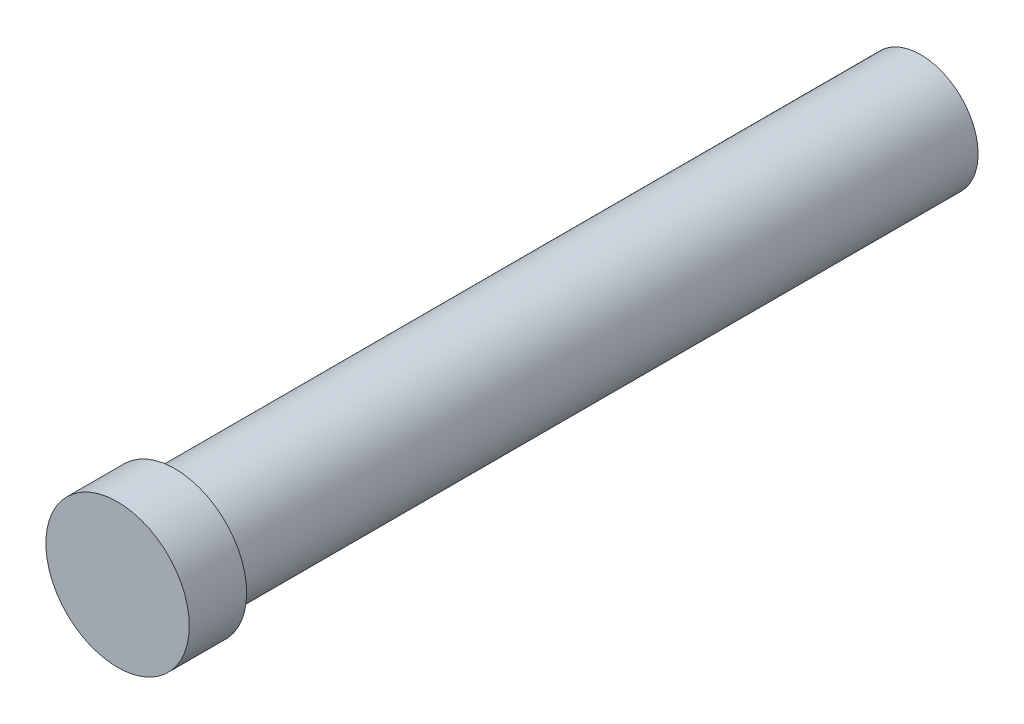
ISO-10303-21;
HEADER;
FILE_DESCRIPTION(('STEP AP214'),'2;1');
FILE_NAME('part.step','',(''),(''),'','','');
FILE_SCHEMA(('AUTOMOTIVE_DESIGN { 1 0 10303 214 1 1 1 1 }'));
ENDSEC;
DATA;
#1=APPLICATION_CONTEXT('core data for automotive mechanical design processes');
#2=APPLICATION_PROTOCOL_DEFINITION('international standard','automotive_design',2000,#1);
#3=PRODUCT_CONTEXT('',#1,'mechanical');
#4=PRODUCT('Part','Part','',(#3));
#5=PRODUCT_RELATED_PRODUCT_CATEGORY('part','',(#4));
#6=PRODUCT_DEFINITION_FORMATION('','',#4);
#7=PRODUCT_DEFINITION_CONTEXT('part definition',#1,'design');
#8=PRODUCT_DEFINITION('design','',#6,#7);
#9=PRODUCT_DEFINITION_SHAPE('','',#8);
#10=(LENGTH_UNIT() NAMED_UNIT(*) SI_UNIT(.MILLI.,.METRE.));
#11=(NAMED_UNIT(*) PLANE_ANGLE_UNIT() SI_UNIT($,.RADIAN.));
#12=(NAMED_UNIT(*) SI_UNIT($,.STERADIAN.) SOLID_ANGLE_UNIT());
#13=UNCERTAINTY_MEASURE_WITH_UNIT(LENGTH_MEASURE(1.E-05),#10,'distance_accuracy_value','');
#14=(GEOMETRIC_REPRESENTATION_CONTEXT(3) GLOBAL_UNCERTAINTY_ASSIGNED_CONTEXT((#13)) GLOBAL_UNIT_ASSIGNED_CONTEXT((#10,
#11,#12)) REPRESENTATION_CONTEXT('',''));
#15=CARTESIAN_POINT('',(0.,0.,0.));
#16=DIRECTION('',(0.,0.,1.));
#17=DIRECTION('',(1.,0.,0.));
#18=AXIS2_PLACEMENT_3D('',#15,#16,#17);
#19=CARTESIAN_POINT('',(0.,0.,13.));
#20=DIRECTION('',(0.,0.,-1.));
#21=DIRECTION('',(-1.,0.,0.));
#22=AXIS2_PLACEMENT_3D('',#19,#20,#21);
#23=CYLINDRICAL_SURFACE('',#22,1.);
#24=CARTESIAN_POINT('',(0.,0.,13.));
#25=DIRECTION('',(0.,0.,1.));
#26=DIRECTION('',(1.,0.,0.));
#27=AXIS2_PLACEMENT_3D('',#24,#25,#26);
#28=CIRCLE('',#27,1.);
#29=CARTESIAN_POINT('',(-1.,0.,13.));
#30=VERTEX_POINT('',#29);
#31=EDGE_CURVE('E10',#30,#30,#28,.T.);
#32=CARTESIAN_POINT('',(0.,0.,0.));
#33=DIRECTION('',(0.,0.,1.));
#34=DIRECTION('',(1.,0.,0.));
#35=AXIS2_PLACEMENT_3D('',#32,#33,#34);
#36=CIRCLE('',#35,1.);
#37=CARTESIAN_POINT('',(-1.,0.,0.));
#38=VERTEX_POINT('',#37);
#39=EDGE_CURVE('E34',#38,#38,#36,.T.);
#40=CARTESIAN_POINT('',(-1.,0.,13.));
#41=CARTESIAN_POINT('',(-1.,0.,12.8645833333333));
#42=CARTESIAN_POINT('',(-1.,0.,12.7291666666667));
#43=CARTESIAN_POINT('',(-1.,0.,12.4583333333333));
#44=CARTESIAN_POINT('',(-1.,0.,12.3229166666667));
#45=CARTESIAN_POINT('',(-1.,0.,12.0520833333333));
#46=CARTESIAN_POINT('',(-1.,0.,11.9166666666667));
#47=CARTESIAN_POINT('',(-1.,0.,11.6458333333333));
#48=CARTESIAN_POINT('',(-1.,0.,11.5104166666667));
#49=CARTESIAN_POINT('',(-1.,0.,11.2395833333333));
#50=CARTESIAN_POINT('',(-1.,0.,11.1041666666667));
#51=CARTESIAN_POINT('',(-1.,0.,10.8333333333333));
#52=CARTESIAN_POINT('',(-1.,0.,10.6979166666667));
#53=CARTESIAN_POINT('',(-1.,0.,10.4270833333333));
#54=CARTESIAN_POINT('',(-1.,0.,10.2916666666667));
#55=CARTESIAN_POINT('',(-1.,0.,10.0208333333333));
#56=CARTESIAN_POINT('',(-1.,0.,9.88541666666667));
#57=CARTESIAN_POINT('',(-1.,0.,9.61458333333333));
#58=CARTESIAN_POINT('',(-1.,0.,9.47916666666667));
#59=CARTESIAN_POINT('',(-1.,0.,9.20833333333333));
#60=CARTESIAN_POINT('',(-1.,0.,9.07291666666666));
#61=CARTESIAN_POINT('',(-1.,0.,8.80208333333333));
#62=CARTESIAN_POINT('',(-1.,0.,8.66666666666667));
#63=CARTESIAN_POINT('',(-1.,0.,8.39583333333333));
#64=CARTESIAN_POINT('',(-1.,0.,8.26041666666667));
#65=CARTESIAN_POINT('',(-1.,0.,7.98958333333333));
#66=CARTESIAN_POINT('',(-1.,0.,7.85416666666667));
#67=CARTESIAN_POINT('',(-1.,0.,7.58333333333333));
#68=CARTESIAN_POINT('',(-1.,0.,7.44791666666667));
#69=CARTESIAN_POINT('',(-1.,0.,7.17708333333333));
#70=CARTESIAN_POINT('',(-1.,0.,7.04166666666667));
#71=CARTESIAN_POINT('',(-1.,0.,6.77083333333333));
#72=CARTESIAN_POINT('',(-1.,0.,6.63541666666667));
#73=CARTESIAN_POINT('',(-1.,0.,6.36458333333333));
#74=CARTESIAN_POINT('',(-1.,0.,6.22916666666667));
#75=CARTESIAN_POINT('',(-1.,0.,5.95833333333333));
#76=CARTESIAN_POINT('',(-1.,0.,5.82291666666667));
#77=CARTESIAN_POINT('',(-1.,0.,5.55208333333333));
#78=CARTESIAN_POINT('',(-1.,0.,5.41666666666667));
#79=CARTESIAN_POINT('',(-1.,0.,5.14583333333333));
#80=CARTESIAN_POINT('',(-1.,0.,5.01041666666667));
#81=CARTESIAN_POINT('',(-1.,0.,4.73958333333333));
#82=CARTESIAN_POINT('',(-1.,0.,4.60416666666667));
#83=CARTESIAN_POINT('',(-1.,0.,4.33333333333333));
#84=CARTESIAN_POINT('',(-1.,0.,4.19791666666667));
#85=CARTESIAN_POINT('',(-1.,0.,3.92708333333333));
#86=CARTESIAN_POINT('',(-1.,0.,3.79166666666667));
#87=CARTESIAN_POINT('',(-1.,0.,3.52083333333333));
#88=CARTESIAN_POINT('',(-1.,0.,3.38541666666667));
#89=CARTESIAN_POINT('',(-1.,0.,3.11458333333333));
#90=CARTESIAN_POINT('',(-1.,0.,2.97916666666667));
#91=CARTESIAN_POINT('',(-1.,0.,2.70833333333333));
#92=CARTESIAN_POINT('',(-1.,0.,2.57291666666667));
#93=CARTESIAN_POINT('',(-1.,0.,2.30208333333333));
#94=CARTESIAN_POINT('',(-1.,0.,2.16666666666667));
#95=CARTESIAN_POINT('',(-1.,0.,1.89583333333333));
#96=CARTESIAN_POINT('',(-1.,0.,1.76041666666667));
#97=CARTESIAN_POINT('',(-1.,0.,1.48958333333333));
#98=CARTESIAN_POINT('',(-1.,0.,1.35416666666667));
#99=CARTESIAN_POINT('',(-1.,0.,1.08333333333333));
#100=CARTESIAN_POINT('',(-1.,0.,0.947916666666667));
#101=CARTESIAN_POINT('',(-1.,0.,0.677083333333334));
#102=CARTESIAN_POINT('',(-1.,0.,0.541666666666667));
#103=CARTESIAN_POINT('',(-1.,0.,0.270833333333334));
#104=CARTESIAN_POINT('',(-1.,0.,0.135416666666667));
#105=CARTESIAN_POINT('',(-1.,0.,0.));
#106=B_SPLINE_CURVE_WITH_KNOTS('',3,(#40,#41,#42,#43,#44,#45,#46,#47,#48,#49,#50,#51,#52,#53,
#54,#55,#56,#57,#58,#59,#60,#61,#62,#63,#64,#65,#66,#67,#68,#69,#70,#71,#72,#73,#74,#75,#76,#77,
#78,#79,#80,#81,#82,#83,#84,#85,#86,#87,#88,#89,#90,#91,#92,#93,#94,#95,#96,#97,#98,#99,#100,
#101,#102,#103,#104,#105),.UNSPECIFIED.,.F.,.F.,(4,2,2,2,2,2,2,2,2,2,2,2,2,2,2,2,2,2,2,2,2,2,2,
2,2,2,2,2,2,2,2,2,4),(0.,0.40625,0.812500000000001,1.21875,1.625,2.03125,2.4375,2.84375,3.25,
3.65625,4.0625,4.46875,4.875,5.28125,5.6875,6.09375,6.5,6.90625,7.3125,7.71875,8.125,8.53125,
8.9375,9.34375,9.75,10.15625,10.5625,10.96875,11.375,11.78125,12.1875,12.59375,13.),.UNSPECIFIED.);
#107=EDGE_CURVE('BSEAM31',#30,#38,#106,.T.);
#108=ORIENTED_EDGE('',*,*,#31,.F.);
#109=ORIENTED_EDGE('',*,*,#39,.T.);
#110=ORIENTED_EDGE('',*,*,#107,.T.);
#111=ORIENTED_EDGE('',*,*,#107,.F.);
#112=EDGE_LOOP('',(#108,#110,#109,#111));
#113=FACE_BOUND('',#112,.T.);
#114=ADVANCED_FACE('F31',(#113),#23,.T.);
#115=CARTESIAN_POINT('',(0.,0.,0.));
#116=DIRECTION('',(0.,0.,1.));
#117=DIRECTION('',(1.,0.,0.));
#118=AXIS2_PLACEMENT_3D('',#115,#116,#117);
#119=PLANE('',#118);
#120=ORIENTED_EDGE('',*,*,#39,.F.);
#121=EDGE_LOOP('',(#120));
#122=FACE_BOUND('',#121,.T.);
#123=ADVANCED_FACE('F54',(#122),#119,.F.);
#124=CARTESIAN_POINT('',(0.,0.,14.));
#125=DIRECTION('',(0.,0.,-1.));
#126=DIRECTION('',(-1.,0.,0.));
#127=AXIS2_PLACEMENT_3D('',#124,#125,#126);
#128=CYLINDRICAL_SURFACE('',#127,1.25);
#129=CARTESIAN_POINT('',(0.,0.,14.));
#130=DIRECTION('',(0.,0.,1.));
#131=DIRECTION('',(1.,0.,0.));
#132=AXIS2_PLACEMENT_3D('',#129,#130,#131);
#133=CIRCLE('',#132,1.25);
#134=CARTESIAN_POINT('',(1.25,0.,14.));
#135=VERTEX_POINT('',#134);
#136=EDGE_CURVE('E41',#135,#135,#133,.T.);
#137=ORIENTED_EDGE('',*,*,#136,.F.);
#138=EDGE_LOOP('',(#137));
#139=FACE_BOUND('',#138,.T.);
#140=CARTESIAN_POINT('',(0.,0.,13.));
#141=DIRECTION('',(0.,0.,1.));
#142=DIRECTION('',(1.,0.,0.));
#143=AXIS2_PLACEMENT_3D('',#140,#141,#142);
#144=CIRCLE('',#143,1.25);
#145=CARTESIAN_POINT('',(1.25,0.,13.));
#146=VERTEX_POINT('',#145);
#147=EDGE_CURVE('E43',#146,#146,#144,.T.);
#148=ORIENTED_EDGE('',*,*,#147,.T.);
#149=EDGE_LOOP('',(#148));
#150=FACE_BOUND('',#149,.T.);
#151=ADVANCED_FACE('F51',(#139,#150),#128,.T.);
#152=CARTESIAN_POINT('',(0.,0.,14.));
#153=DIRECTION('',(0.,0.,1.));
#154=DIRECTION('',(1.,0.,0.));
#155=AXIS2_PLACEMENT_3D('',#152,#153,#154);
#156=PLANE('',#155);
#157=ORIENTED_EDGE('',*,*,#136,.T.);
#158=EDGE_LOOP('',(#157));
#159=FACE_BOUND('',#158,.T.);
#160=ADVANCED_FACE('F49',(#159),#156,.T.);
#161=CARTESIAN_POINT('',(0.,0.,13.));
#162=DIRECTION('',(0.,0.,1.));
#163=DIRECTION('',(1.,0.,0.));
#164=AXIS2_PLACEMENT_3D('',#161,#162,#163);
#165=PLANE('',#164);
#166=ORIENTED_EDGE('',*,*,#31,.T.);
#167=EDGE_LOOP('',(#166));
#168=FACE_BOUND('',#167,.T.);
#169=ORIENTED_EDGE('',*,*,#147,.F.);
#170=EDGE_LOOP('',(#169));
#171=FACE_BOUND('',#170,.T.);
#172=ADVANCED_FACE('F58',(#168,#171),#165,.F.);
#173=CLOSED_SHELL('',(#114,#123,#151,#160,#172));
#174=MANIFOLD_SOLID_BREP('B2',#173);
#175=ADVANCED_BREP_SHAPE_REPRESENTATION('',(#18,#174),#14);
#176=SHAPE_DEFINITION_REPRESENTATION(#9,#175);
ENDSEC;
END-ISO-10303-21;
